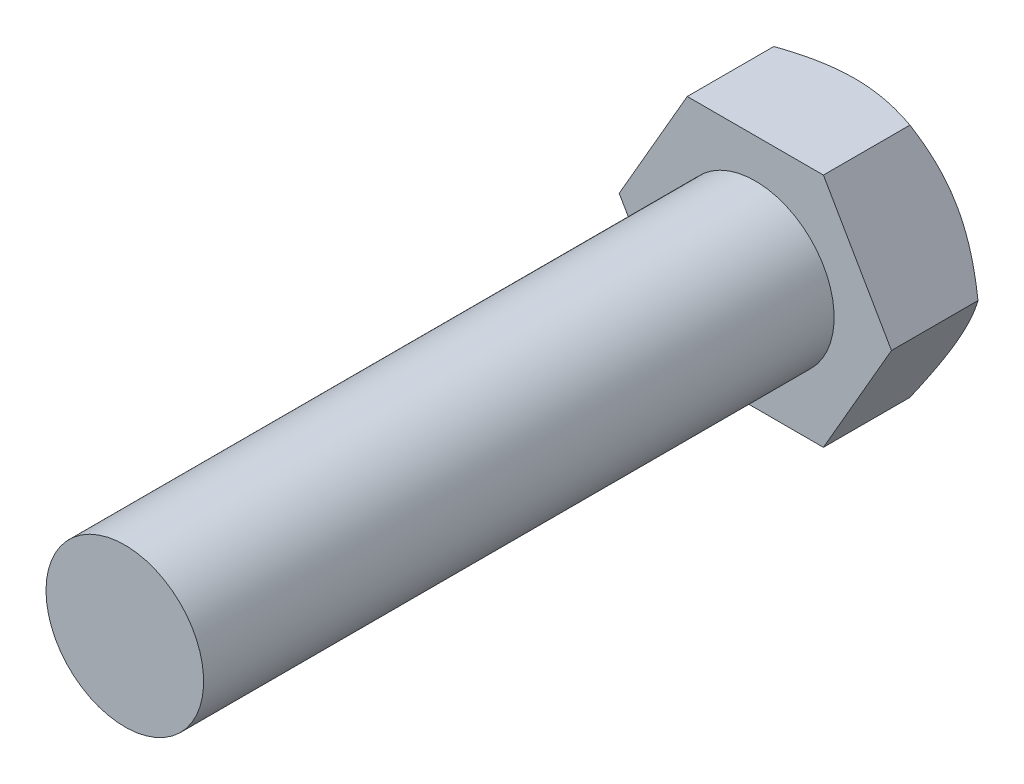
ISO-10303-21;
HEADER;
FILE_DESCRIPTION(('STEP AP214'),'2;1');
FILE_NAME('part.step','',(''),(''),'','','');
FILE_SCHEMA(('AUTOMOTIVE_DESIGN { 1 0 10303 214 1 1 1 1 }'));
ENDSEC;
DATA;
#1=APPLICATION_CONTEXT('core data for automotive mechanical design processes');
#2=APPLICATION_PROTOCOL_DEFINITION('international standard','automotive_design',2000,#1);
#3=PRODUCT_CONTEXT('',#1,'mechanical');
#4=PRODUCT('Part','Part','',(#3));
#5=PRODUCT_RELATED_PRODUCT_CATEGORY('part','',(#4));
#6=PRODUCT_DEFINITION_FORMATION('','',#4);
#7=PRODUCT_DEFINITION_CONTEXT('part definition',#1,'design');
#8=PRODUCT_DEFINITION('design','',#6,#7);
#9=PRODUCT_DEFINITION_SHAPE('','',#8);
#10=(LENGTH_UNIT() NAMED_UNIT(*) SI_UNIT(.MILLI.,.METRE.));
#11=(NAMED_UNIT(*) PLANE_ANGLE_UNIT() SI_UNIT($,.RADIAN.));
#12=(NAMED_UNIT(*) SI_UNIT($,.STERADIAN.) SOLID_ANGLE_UNIT());
#13=UNCERTAINTY_MEASURE_WITH_UNIT(LENGTH_MEASURE(1.E-05),#10,'distance_accuracy_value','');
#14=(GEOMETRIC_REPRESENTATION_CONTEXT(3) GLOBAL_UNCERTAINTY_ASSIGNED_CONTEXT((#13)) GLOBAL_UNIT_ASSIGNED_CONTEXT((#10,
#11,#12)) REPRESENTATION_CONTEXT('',''));
#15=CARTESIAN_POINT('',(0.,0.,0.));
#16=DIRECTION('',(0.,0.,1.));
#17=DIRECTION('',(1.,0.,0.));
#18=AXIS2_PLACEMENT_3D('',#15,#16,#17);
#19=CARTESIAN_POINT('',(8.22724133595232,-14.2499999999999,12.));
#20=DIRECTION('',(-0.866025403784441,0.499999999999995,0.));
#21=DIRECTION('',(-0.499999999999995,-0.866025403784442,0.));
#22=AXIS2_PLACEMENT_3D('',#19,#20,#21);
#23=PLANE('',#22);
#24=CARTESIAN_POINT('',(16.4545981419581,0.0002,1.54367623857331));
#25=CARTESIAN_POINT('',(16.2702027710889,-0.319182151026049,1.41457686556177));
#26=CARTESIAN_POINT('',(16.0847650075566,-0.64036977910591,1.29122129039313));
#27=CARTESIAN_POINT('',(15.7116973485323,-1.28654191919686,1.05783192254373));
#28=CARTESIAN_POINT('',(15.5240662870316,-1.61152845079415,0.947805605471427));
#29=CARTESIAN_POINT('',(15.1460050372611,-2.26634974376955,0.742674523883902));
#30=CARTESIAN_POINT('',(14.9555670057257,-2.5961980900823,0.647627094148037));
#31=CARTESIAN_POINT('',(14.5727278063531,-3.25929503452465,0.474996152203521));
#32=CARTESIAN_POINT('',(14.3803268349797,-3.592543292369,0.397410909846706));
#33=CARTESIAN_POINT('',(14.0008445291337,-4.24982592666768,0.26411196974776));
#34=CARTESIAN_POINT('',(13.8138244959943,-4.57375412609829,0.207704921734018));
#35=CARTESIAN_POINT('',(13.4385545784171,-5.22374068989432,0.114408315622114));
#36=CARTESIAN_POINT('',(13.2503046586876,-5.54979911538644,0.0775193201055583));
#37=CARTESIAN_POINT('',(12.87344399038,-6.2025409402697,0.0243983907336545));
#38=CARTESIAN_POINT('',(12.6848346786154,-6.52922185102659,0.00812599123836344));
#39=CARTESIAN_POINT('',(12.3074611283429,-7.1828520135311,-0.00338701659723766));
#40=CARTESIAN_POINT('',(12.1186968991966,-7.50980124906417,0.00137118609882797));
#41=CARTESIAN_POINT('',(11.7746279039238,-8.10574623018576,0.0290951119164761));
#42=CARTESIAN_POINT('',(11.6192531423396,-8.37486321146353,0.0487260549035489));
#43=CARTESIAN_POINT('',(11.3090929043488,-8.91207650215121,0.101771163045533));
#44=CARTESIAN_POINT('',(11.1543074321104,-9.18017280434171,0.135185425509894));
#45=CARTESIAN_POINT('',(10.8453822679376,-9.71524688442554,0.215198809661225));
#46=CARTESIAN_POINT('',(10.6912437385497,-9.98222264872932,0.261815776325662));
#47=CARTESIAN_POINT('',(10.384032194092,-10.5143286524018,0.367369149565712));
#48=CARTESIAN_POINT('',(10.2309591778352,-10.7794588938264,0.426305542415093));
#49=CARTESIAN_POINT('',(9.76401729285871,-11.5882259627877,0.624205597351124));
#50=CARTESIAN_POINT('',(9.4521077341481,-12.1284691658409,0.781664620654106));
#51=CARTESIAN_POINT('',(8.83483636934868,-13.1976145317309,1.13561787222836));
#52=CARTESIAN_POINT('',(8.52945782645586,-13.7265456835626,1.33199442517409));
#53=CARTESIAN_POINT('',(8.22712586589848,-14.2501999999999,1.54367623857331));
#54=B_SPLINE_CURVE_WITH_KNOTS('',3,(#24,#25,#26,#27,#28,#29,#30,#31,#32,#33,#34,#35,#36,#37,#38,
#39,#40,#41,#42,#43,#44,#45,#46,#47,#48,#49,#50,#51,#52,#53),.UNSPECIFIED.,.F.,.F.,(4,2,2,2,2,2,
2,2,2,2,2,2,2,2,4),(0.,1.17225958175616,2.34517360185186,3.52247351348348,4.6996567272014,
5.83398877469892,6.96835351601078,8.10048829320421,9.2325590660559,10.1663611394386,
11.1001698055235,12.0352466950305,12.9703225426859,14.8989154466219,16.8217634539733),.UNSPECIFIED.);
#55=CARTESIAN_POINT('',(16.4544826719043,0.,1.5435953847201));
#56=VERTEX_POINT('',#55);
#57=CARTESIAN_POINT('',(12.3408620039283,-7.12499999999991,0.));
#58=VERTEX_POINT('',#57);
#59=EDGE_CURVE('E125',#56,#58,#54,.T.);
#60=ORIENTED_EDGE('',*,*,#59,.F.);
#61=DIRECTION('',(0.,0.,-1.));
#62=VECTOR('',#61,1.);
#63=CARTESIAN_POINT('',(16.4544826719043,0.,12.));
#64=LINE('',#63,#62);
#65=CARTESIAN_POINT('',(16.4544826719043,0.,12.));
#66=VERTEX_POINT('',#65);
#67=EDGE_CURVE('E129',#66,#56,#64,.T.);
#68=ORIENTED_EDGE('',*,*,#67,.F.);
#69=DIRECTION('',(0.499999999999995,0.866025403784442,0.));
#70=VECTOR('',#69,1.);
#71=CARTESIAN_POINT('',(8.22724133595232,-14.2499999999999,12.));
#72=LINE('',#71,#70);
#73=CARTESIAN_POINT('',(8.22724133595232,-14.2499999999999,12.));
#74=VERTEX_POINT('',#73);
#75=EDGE_CURVE('E224',#74,#66,#72,.T.);
#76=ORIENTED_EDGE('',*,*,#75,.F.);
#77=DIRECTION('',(0.,0.,-1.));
#78=VECTOR('',#77,1.);
#79=CARTESIAN_POINT('',(8.22724133595232,-14.2499999999999,12.));
#80=LINE('',#79,#78);
#81=CARTESIAN_POINT('',(8.22724133595232,-14.2499999999999,1.5435953847201));
#82=VERTEX_POINT('',#81);
#83=EDGE_CURVE('E212',#74,#82,#80,.T.);
#84=ORIENTED_EDGE('',*,*,#83,.T.);
#85=EDGE_CURVE('E180',#58,#82,#54,.T.);
#86=ORIENTED_EDGE('',*,*,#85,.F.);
#87=EDGE_LOOP('',(#60,#68,#76,#84,#86));
#88=FACE_BOUND('',#87,.T.);
#89=ADVANCED_FACE('F35',(#88),#23,.F.);
#90=CARTESIAN_POINT('',(16.4544826719043,0.,12.));
#91=DIRECTION('',(-0.866025403784438,-0.500000000000001,0.));
#92=DIRECTION('',(0.500000000000001,-0.866025403784438,0.));
#93=AXIS2_PLACEMENT_3D('',#90,#91,#92);
#94=PLANE('',#93);
#95=CARTESIAN_POINT('',(8.22712586589829,14.2502,1.54367623857331));
#96=CARTESIAN_POINT('',(8.41152123676754,13.930817848974,1.41457686556177));
#97=CARTESIAN_POINT('',(8.59695900029982,13.6096302208941,1.29122129039313));
#98=CARTESIAN_POINT('',(8.97002665932416,12.9634580808032,1.05783192254373));
#99=CARTESIAN_POINT('',(9.15765772082486,12.6384715492059,0.947805605471423));
#100=CARTESIAN_POINT('',(9.53571897059531,11.9836502562305,0.742674523883895));
#101=CARTESIAN_POINT('',(9.72615700213073,11.6538019099177,0.647627094148027));
#102=CARTESIAN_POINT('',(10.1089962015033,10.9907049654754,0.474996152203506));
#103=CARTESIAN_POINT('',(10.3013971728767,10.657456707631,0.39741090984669));
#104=CARTESIAN_POINT('',(10.6808794787228,10.0001740733323,0.26411196974774));
#105=CARTESIAN_POINT('',(10.8678995118621,9.67624587390173,0.207704921733996));
#106=CARTESIAN_POINT('',(11.2431694294394,9.0262593101057,0.114408315622088));
#107=CARTESIAN_POINT('',(11.4314193491688,8.70020088461359,0.0775193201055301));
#108=CARTESIAN_POINT('',(11.8082800174765,8.04745905973033,0.0243983907336221));
#109=CARTESIAN_POINT('',(11.9968893292411,7.72077814897344,0.00812599123832916));
#110=CARTESIAN_POINT('',(12.3742628795135,7.06714798646893,-0.00338701659727748));
#111=CARTESIAN_POINT('',(12.5630271086599,6.74019875093587,0.00137118609878444));
#112=CARTESIAN_POINT('',(12.9070961039327,6.14425376981427,0.0290951119164303));
#113=CARTESIAN_POINT('',(13.0624708655169,5.8751367885365,0.0487260549035043));
#114=CARTESIAN_POINT('',(13.3726311035077,5.3379234978488,0.101771163045488));
#115=CARTESIAN_POINT('',(13.5274165757461,5.0698271956583,0.135185425509848));
#116=CARTESIAN_POINT('',(13.8363417399189,4.53475311557446,0.215198809661179));
#117=CARTESIAN_POINT('',(13.9904802693068,4.26777735127067,0.261815776325618));
#118=CARTESIAN_POINT('',(14.2976918137645,3.7356713475982,0.36736914956567));
#119=CARTESIAN_POINT('',(14.4507648300213,3.47054110617358,0.426305542415053));
#120=CARTESIAN_POINT('',(14.9177067149979,2.66177403721225,0.624205597351089));
#121=CARTESIAN_POINT('',(15.2296162737085,2.12153083415906,0.781664620654077));
#122=CARTESIAN_POINT('',(15.8468876385079,1.05238546826904,1.13561787222834));
#123=CARTESIAN_POINT('',(16.1522661814008,0.523454316437301,1.33199442517408));
#124=CARTESIAN_POINT('',(16.4545981419581,-0.000200000000002765,1.54367623857331));
#125=B_SPLINE_CURVE_WITH_KNOTS('',3,(#95,#96,#97,#98,#99,#100,#101,#102,#103,#104,#105,#106,
#107,#108,#109,#110,#111,#112,#113,#114,#115,#116,#117,#118,#119,#120,#121,#122,#123,#124),
.UNSPECIFIED.,.F.,.F.,(4,2,2,2,2,2,2,2,2,2,2,2,2,2,4),(0.,1.17225958175616,2.34517360185185,
3.52247351348347,4.6996567272014,5.83398877469892,6.96835351601078,8.10048829320421,
9.2325590660559,10.1663611394386,11.1001698055236,12.0352466950306,12.970322542686,
14.898915446622,16.8217634539735),.UNSPECIFIED.);
#126=CARTESIAN_POINT('',(8.22724133595213,14.25,1.5435953847201));
#127=VERTEX_POINT('',#126);
#128=CARTESIAN_POINT('',(12.3408620039282,7.125,0.));
#129=VERTEX_POINT('',#128);
#130=EDGE_CURVE('E106',#127,#129,#125,.T.);
#131=ORIENTED_EDGE('',*,*,#130,.F.);
#132=DIRECTION('',(0.,0.,-1.));
#133=VECTOR('',#132,1.);
#134=CARTESIAN_POINT('',(8.22724133595212,14.25,12.));
#135=LINE('',#134,#133);
#136=CARTESIAN_POINT('',(8.22724133595212,14.25,12.));
#137=VERTEX_POINT('',#136);
#138=EDGE_CURVE('E209',#137,#127,#135,.T.);
#139=ORIENTED_EDGE('',*,*,#138,.F.);
#140=DIRECTION('',(-0.500000000000001,0.866025403784438,0.));
#141=VECTOR('',#140,1.);
#142=CARTESIAN_POINT('',(16.4544826719043,0.,12.));
#143=LINE('',#142,#141);
#144=EDGE_CURVE('E221',#66,#137,#143,.T.);
#145=ORIENTED_EDGE('',*,*,#144,.F.);
#146=ORIENTED_EDGE('',*,*,#67,.T.);
#147=EDGE_CURVE('E118',#129,#56,#125,.T.);
#148=ORIENTED_EDGE('',*,*,#147,.F.);
#149=EDGE_LOOP('',(#131,#139,#145,#146,#148));
#150=FACE_BOUND('',#149,.T.);
#151=ADVANCED_FACE('F134',(#150),#94,.F.);
#152=CARTESIAN_POINT('',(8.22724133595212,14.25,12.));
#153=DIRECTION('',(0.,-1.,0.));
#154=DIRECTION('',(1.,0.,0.));
#155=AXIS2_PLACEMENT_3D('',#152,#153,#154);
#156=PLANE('',#155);
#157=CARTESIAN_POINT('',(-21.0307797019653,14.2499999999999,7.81001811966322));
#158=CARTESIAN_POINT('',(-20.7483823576286,14.2499999999999,7.64632331947967));
#159=CARTESIAN_POINT('',(-20.4655379412463,14.2499999999999,7.4834001850228));
#160=CARTESIAN_POINT('',(-19.8988662895447,14.2499999999999,7.15926464174982));
#161=CARTESIAN_POINT('',(-19.6150390424903,14.2499999999999,6.99805225345443));
#162=CARTESIAN_POINT('',(-18.7618621687209,14.2499999999999,6.51718290891407));
#163=CARTESIAN_POINT('',(-18.1909147117392,14.2499999999999,6.2003503264211));
#164=CARTESIAN_POINT('',(-17.0403422421381,14.2499999999999,5.57396574075119));
#165=CARTESIAN_POINT('',(-16.4606851849295,14.2499999999999,5.26447246356248));
#166=CARTESIAN_POINT('',(-15.2953015030134,14.2499999999999,4.65717125551426));
#167=CARTESIAN_POINT('',(-14.7095752125618,14.2499999999999,4.35936268541163));
#168=CARTESIAN_POINT('',(-13.5040829750654,14.2499999999999,3.76522851801957));
#169=CARTESIAN_POINT('',(-12.8839793072316,14.2499999999999,3.46958468052069));
#170=CARTESIAN_POINT('',(-11.6342031113975,14.2499999999999,2.89887033998608));
#171=CARTESIAN_POINT('',(-11.0045292947839,14.2499999999999,2.62380263757454));
#172=CARTESIAN_POINT('',(-9.73556643770717,14.2499999999999,2.1009998327649));
#173=CARTESIAN_POINT('',(-9.09630319830344,14.2499999999999,1.85320258200597));
#174=CARTESIAN_POINT('',(-7.80546022735872,14.2499999999999,1.39216829623307));
#175=CARTESIAN_POINT('',(-7.15388517918682,14.2499999999999,1.17891840372017));
#176=CARTESIAN_POINT('',(-6.15490103920526,14.2499999999999,0.888784713402826));
#177=CARTESIAN_POINT('',(-5.81217699592205,14.25,0.79569769642083));
#178=CARTESIAN_POINT('',(-5.12335190996157,14.25,0.622912642539462));
#179=CARTESIAN_POINT('',(-4.77725095115967,14.25,0.543214273985806));
#180=CARTESIAN_POINT('',(-4.08198738138723,14.25,0.398706557868054));
#181=CARTESIAN_POINT('',(-3.73282520177465,14.25,0.333895146500978));
#182=CARTESIAN_POINT('',(-3.03187366457333,14.25,0.220548347806509));
#183=CARTESIAN_POINT('',(-2.6800844898489,14.25,0.172011838187856));
#184=CARTESIAN_POINT('',(-1.98082678630545,14.25,0.0930929977810811));
#185=CARTESIAN_POINT('',(-1.63339333688098,14.25,0.0624018506834644));
#186=CARTESIAN_POINT('',(-0.937416049600682,14.25,0.0186216361508801));
#187=CARTESIAN_POINT('',(-0.588872230500853,14.25,0.00553227295591957));
#188=CARTESIAN_POINT('',(0.108457010376487,14.25,-0.00269726296584866));
#189=CARTESIAN_POINT('',(0.457242448764197,14.25,0.00216395348047377));
#190=CARTESIAN_POINT('',(1.15410748647395,14.25,0.0297062624075028));
#191=CARTESIAN_POINT('',(1.50218706805267,14.25,0.052387797409515));
#192=CARTESIAN_POINT('',(2.23397893002818,14.25,0.118341658495994));
#193=CARTESIAN_POINT('',(2.61751657393895,14.25,0.163558397540984));
#194=CARTESIAN_POINT('',(3.3817017282793,14.25,0.273770735943497));
#195=CARTESIAN_POINT('',(3.76234910401614,14.25,0.338767251353207));
#196=CARTESIAN_POINT('',(4.89916132273453,14.25,0.560923639802966));
#197=CARTESIAN_POINT('',(5.65012671605997,14.25,0.745243534894716));
#198=CARTESIAN_POINT('',(6.77339561256118,14.25,1.0671421899277));
#199=CARTESIAN_POINT('',(7.15202190719991,14.25,1.18377650694768));
#200=CARTESIAN_POINT('',(7.90504472585432,14.25,1.43008700865407));
#201=CARTESIAN_POINT('',(8.27944120203226,14.25,1.55976334067712));
#202=CARTESIAN_POINT('',(9.02405598500581,14.25,1.83034808142679));
#203=CARTESIAN_POINT('',(9.39427496097174,14.25,1.97125466122707));
#204=CARTESIAN_POINT('',(9.94670366195413,14.25,2.18987612495198));
#205=CARTESIAN_POINT('',(10.1303605268574,14.25,2.26395904254066));
#206=CARTESIAN_POINT('',(10.4967508379489,14.25,2.41437593090951));
#207=CARTESIAN_POINT('',(10.6794842809345,14.25,2.49070990949077));
#208=CARTESIAN_POINT('',(11.2438796387109,14.25,2.73027732491905));
#209=CARTESIAN_POINT('',(11.6240427879813,14.25,2.89705018205499));
#210=CARTESIAN_POINT('',(12.3808443413054,14.25,3.23843099074409));
#211=CARTESIAN_POINT('',(12.7574825499094,14.25,3.41303937368461));
#212=CARTESIAN_POINT('',(13.5076391518044,14.25,3.76900351806248));
#213=CARTESIAN_POINT('',(13.8811569414281,14.25,3.95036054968127));
#214=CARTESIAN_POINT('',(14.6253304739946,14.25,4.31886226783892));
#215=CARTESIAN_POINT('',(14.9959861478449,14.25,4.50600709355485));
#216=CARTESIAN_POINT('',(16.1047253967806,14.25,5.07522112106339));
#217=CARTESIAN_POINT('',(16.8389687093434,14.25,5.46477601492714));
#218=CARTESIAN_POINT('',(18.2991651712054,14.25,6.25887156441082));
#219=CARTESIAN_POINT('',(19.0251190762284,14.25,6.66341083944026));
#220=CARTESIAN_POINT('',(20.4729534117608,14.25,7.4855095081588));
#221=CARTESIAN_POINT('',(21.1948107949419,14.25,7.90310940213855));
#222=CARTESIAN_POINT('',(22.6331671431204,14.25,8.74744581742437));
#223=CARTESIAN_POINT('',(23.3496660066554,14.2500000000001,9.17418251114567));
#224=CARTESIAN_POINT('',(24.777939315821,14.2500000000001,10.0347104386038));
#225=CARTESIAN_POINT('',(25.4897158637858,14.2500000000001,10.4684981884054));
#226=CARTESIAN_POINT('',(26.9096598703761,14.2500000000001,11.3419223321648));
#227=CARTESIAN_POINT('',(27.6178273550484,14.2500000000001,11.7815586838301));
#228=CARTESIAN_POINT('',(28.9335887273037,14.2500000000001,12.604579120696));
#229=CARTESIAN_POINT('',(29.5415676905293,14.2500000000001,12.9873482752793));
#230=CARTESIAN_POINT('',(30.7556135160704,14.2500000000001,13.7559082237712));
#231=CARTESIAN_POINT('',(31.3616803741865,14.2500000000001,14.1416990243094));
#232=CARTESIAN_POINT('',(33.1775718118149,14.2500000000001,15.3030252977204));
#233=CARTESIAN_POINT('',(34.3849307145724,14.2500000000001,16.0824163923204));
#234=CARTESIAN_POINT('',(36.7863879492325,14.2500000000001,17.6434649177575));
#235=CARTESIAN_POINT('',(37.9805203918267,14.2500000000001,18.4250699712967));
#236=CARTESIAN_POINT('',(39.7687535007112,14.2500000000001,19.6017705920974));
#237=CARTESIAN_POINT('',(40.3642891725478,14.2500000000001,19.9946878693449));
#238=CARTESIAN_POINT('',(41.5545057310709,14.2500000000001,20.7818122763548));
#239=CARTESIAN_POINT('',(42.1491866196047,14.2500000000001,21.1760194033236));
#240=CARTESIAN_POINT('',(42.7434921426331,14.2500000000001,21.5707914469479));
#241=B_SPLINE_CURVE_WITH_KNOTS('',3,(#157,#158,#159,#160,#161,#162,#163,#164,#165,#166,#167,
#168,#169,#170,#171,#172,#173,#174,#175,#176,#177,#178,#179,#180,#181,#182,#183,#184,#185,#186,
#187,#188,#189,#190,#191,#192,#193,#194,#195,#196,#197,#198,#199,#200,#201,#202,#203,#204,#205,
#206,#207,#208,#209,#210,#211,#212,#213,#214,#215,#216,#217,#218,#219,#220,#221,#222,#223,#224,
#225,#226,#227,#228,#229,#230,#231,#232,#233,#234,#235,#236,#237,#238,#239,#240),.UNSPECIFIED.,
.F.,.F.,(4,2,2,2,2,2,2,2,2,2,2,2,2,2,2,2,2,2,2,2,2,2,2,2,2,2,2,2,2,2,2,2,2,2,2,2,2,2,2,2,2,4),
(0.,0.979231234309724,1.95847420142742,3.91729774202127,5.88851105642767,7.859616379545,
9.92025145556761,11.9811664968548,14.0372830301485,16.0926325713103,17.1578335686469,
18.2230081756736,19.2880350265764,20.3529884198158,21.3989175407043,22.4448290867914,
23.4908215763742,24.5368400412835,25.6948409267628,26.8528954503977,29.1692132143132,
30.3576166277267,31.5460334681327,32.734257160275,33.3283511284294,33.9224471556704,
35.1677373504036,36.4130961892996,37.6586906179924,38.9043150223862,41.3976010899977,
43.8906580065778,46.3924126125239,48.8942144693065,51.3948156502804,53.8953987586699,
56.0506975557643,58.2060010830163,62.5171625723639,66.7986988325867,68.9391227376693,
71.0795420101602),.UNSPECIFIED.);
#242=CARTESIAN_POINT('',(-8.22724133595222,14.2499999999999,1.5435953847201));
#243=VERTEX_POINT('',#242);
#244=CARTESIAN_POINT('',(0.,14.25,0.));
#245=VERTEX_POINT('',#244);
#246=EDGE_CURVE('E51',#243,#245,#241,.T.);
#247=ORIENTED_EDGE('',*,*,#246,.F.);
#248=DIRECTION('',(0.,0.,-1.));
#249=VECTOR('',#248,1.);
#250=CARTESIAN_POINT('',(-8.22724133595222,14.2499999999999,12.));
#251=LINE('',#250,#249);
#252=CARTESIAN_POINT('',(-8.22724133595222,14.2499999999999,12.));
#253=VERTEX_POINT('',#252);
#254=EDGE_CURVE('E206',#253,#243,#251,.T.);
#255=ORIENTED_EDGE('',*,*,#254,.F.);
#256=DIRECTION('',(-1.,0.,0.));
#257=VECTOR('',#256,1.);
#258=CARTESIAN_POINT('',(8.22724133595212,14.25,12.));
#259=LINE('',#258,#257);
#260=EDGE_CURVE('E220',#137,#253,#259,.T.);
#261=ORIENTED_EDGE('',*,*,#260,.F.);
#262=ORIENTED_EDGE('',*,*,#138,.T.);
#263=EDGE_CURVE('E112',#245,#127,#241,.T.);
#264=ORIENTED_EDGE('',*,*,#263,.F.);
#265=EDGE_LOOP('',(#247,#255,#261,#262,#264));
#266=FACE_BOUND('',#265,.T.);
#267=ADVANCED_FACE('F218',(#266),#156,.F.);
#268=CARTESIAN_POINT('',(-8.22724133595222,14.2499999999999,12.));
#269=DIRECTION('',(0.866025403784441,-0.499999999999995,0.));
#270=DIRECTION('',(0.499999999999995,0.866025403784442,0.));
#271=AXIS2_PLACEMENT_3D('',#268,#269,#270);
#272=PLANE('',#271);
#273=CARTESIAN_POINT('',(-16.4545981419581,-0.00020000000011454,1.54367623857331));
#274=CARTESIAN_POINT('',(-16.2702027710889,0.319182151025933,1.41457686556176));
#275=CARTESIAN_POINT('',(-16.0847650075566,0.640369779105794,1.29122129039312));
#276=CARTESIAN_POINT('',(-15.7116973485323,1.28654191919674,1.05783192254372));
#277=CARTESIAN_POINT('',(-15.5240662870316,1.61152845079403,0.947805605471421));
#278=CARTESIAN_POINT('',(-15.1460050372611,2.26634974376943,0.742674523883893));
#279=CARTESIAN_POINT('',(-14.9555670057257,2.59619809008218,0.647627094148027));
#280=CARTESIAN_POINT('',(-14.5727278063531,3.25929503452453,0.474996152203507));
#281=CARTESIAN_POINT('',(-14.3803268349797,3.59254329236888,0.397410909846689));
#282=CARTESIAN_POINT('',(-14.0008445291337,4.24982592666756,0.264111969747739));
#283=CARTESIAN_POINT('',(-13.8138244959943,4.57375412609817,0.207704921733994));
#284=CARTESIAN_POINT('',(-13.4385545784171,5.2237406898942,0.114408315622086));
#285=CARTESIAN_POINT('',(-13.2503046586877,5.54979911538631,0.0775193201055287));
#286=CARTESIAN_POINT('',(-12.87344399038,6.20254094026958,0.0243983907336211));
#287=CARTESIAN_POINT('',(-12.6848346786154,6.52922185102647,0.00812599123832832));
#288=CARTESIAN_POINT('',(-12.3074611283429,7.18285201353098,-0.00338701659727724));
#289=CARTESIAN_POINT('',(-12.1186968991966,7.50980124906404,0.00137118609878552));
#290=CARTESIAN_POINT('',(-11.7746279039238,8.10574623018564,0.0290951119164306));
#291=CARTESIAN_POINT('',(-11.6192531423396,8.37486321146342,0.0487260549035033));
#292=CARTESIAN_POINT('',(-11.3090929043488,8.91207650215112,0.101771163045486));
#293=CARTESIAN_POINT('',(-11.1543074321104,9.18017280434162,0.135185425509848));
#294=CARTESIAN_POINT('',(-10.8453822679376,9.71524688442546,0.215198809661179));
#295=CARTESIAN_POINT('',(-10.6912437385497,9.98222264872925,0.261815776325618));
#296=CARTESIAN_POINT('',(-10.384032194092,10.5143286524017,0.36736914956567));
#297=CARTESIAN_POINT('',(-10.2309591778352,10.7794588938263,0.426305542415053));
#298=CARTESIAN_POINT('',(-9.76401729285866,11.5882259627877,0.624205597351091));
#299=CARTESIAN_POINT('',(-9.45210773414803,12.1284691658409,0.781664620654079));
#300=CARTESIAN_POINT('',(-8.8348363693486,13.1976145317309,1.13561787222834));
#301=CARTESIAN_POINT('',(-8.52945782645577,13.7265456835626,1.33199442517408));
#302=CARTESIAN_POINT('',(-8.22712586589838,14.2501999999999,1.54367623857331));
#303=B_SPLINE_CURVE_WITH_KNOTS('',3,(#273,#274,#275,#276,#277,#278,#279,#280,#281,#282,#283,
#284,#285,#286,#287,#288,#289,#290,#291,#292,#293,#294,#295,#296,#297,#298,#299,#300,#301,#302),
.UNSPECIFIED.,.F.,.F.,(4,2,2,2,2,2,2,2,2,2,2,2,2,2,4),(0.,1.17225958175616,2.34517360185185,
3.52247351348347,4.6996567272014,5.83398877469892,6.96835351601078,8.10048829320421,
9.2325590660559,10.1663611394386,11.1001698055236,12.0352466950306,12.970322542686,
14.898915446622,16.8217634539735),.UNSPECIFIED.);
#304=CARTESIAN_POINT('',(-16.4544826719043,-1.14889862020934E-13,1.5435953847201));
#305=VERTEX_POINT('',#304);
#306=CARTESIAN_POINT('',(-12.3408620039283,7.12499999999991,0.));
#307=VERTEX_POINT('',#306);
#308=EDGE_CURVE('E58',#305,#307,#303,.T.);
#309=ORIENTED_EDGE('',*,*,#308,.F.);
#310=DIRECTION('',(0.,0.,-1.));
#311=VECTOR('',#310,1.);
#312=CARTESIAN_POINT('',(-16.4544826719043,-1.14901038378543E-13,12.));
#313=LINE('',#312,#311);
#314=CARTESIAN_POINT('',(-16.4544826719043,-1.14901038378543E-13,12.));
#315=VERTEX_POINT('',#314);
#316=EDGE_CURVE('E200',#315,#305,#313,.T.);
#317=ORIENTED_EDGE('',*,*,#316,.F.);
#318=DIRECTION('',(-0.499999999999995,-0.866025403784442,0.));
#319=VECTOR('',#318,1.);
#320=CARTESIAN_POINT('',(-8.22724133595222,14.2499999999999,12.));
#321=LINE('',#320,#319);
#322=EDGE_CURVE('E239',#253,#315,#321,.T.);
#323=ORIENTED_EDGE('',*,*,#322,.F.);
#324=ORIENTED_EDGE('',*,*,#254,.T.);
#325=EDGE_CURVE('E117',#307,#243,#303,.T.);
#326=ORIENTED_EDGE('',*,*,#325,.F.);
#327=EDGE_LOOP('',(#309,#317,#323,#324,#326));
#328=FACE_BOUND('',#327,.T.);
#329=ADVANCED_FACE('F198',(#328),#272,.F.);
#330=CARTESIAN_POINT('',(-16.4544826719043,-1.14901038378543E-13,12.));
#331=DIRECTION('',(0.866025403784434,0.500000000000007,0.));
#332=DIRECTION('',(-0.500000000000007,0.866025403784435,0.));
#333=AXIS2_PLACEMENT_3D('',#330,#331,#332);
#334=PLANE('',#333);
#335=CARTESIAN_POINT('',(-8.22712586589818,-14.2502000000001,1.54367623857331));
#336=CARTESIAN_POINT('',(-8.41152123676744,-13.930817848974,1.41457686556176));
#337=CARTESIAN_POINT('',(-8.59695900029972,-13.6096302208942,1.29122129039312));
#338=CARTESIAN_POINT('',(-8.97002665932407,-12.9634580808032,1.05783192254372));
#339=CARTESIAN_POINT('',(-9.15765772082477,-12.6384715492059,0.94780560547142));
#340=CARTESIAN_POINT('',(-9.53571897059522,-11.9836502562305,0.742674523883891));
#341=CARTESIAN_POINT('',(-9.72615700213064,-11.6538019099178,0.647627094148025));
#342=CARTESIAN_POINT('',(-10.1089962015033,-10.9907049654754,0.474996152203505));
#343=CARTESIAN_POINT('',(-10.3013971728767,-10.6574567076311,0.397410909846687));
#344=CARTESIAN_POINT('',(-10.6808794787227,-10.0001740733324,0.264111969747738));
#345=CARTESIAN_POINT('',(-10.8678995118621,-9.67624587390181,0.207704921733995));
#346=CARTESIAN_POINT('',(-11.2431694294393,-9.02625931010578,0.114408315622088));
#347=CARTESIAN_POINT('',(-11.4314193491688,-8.70020088461367,0.0775193201055291));
#348=CARTESIAN_POINT('',(-11.8082800174764,-8.04745905973041,0.0243983907336206));
#349=CARTESIAN_POINT('',(-11.996889329241,-7.72077814897353,0.00812599123832783));
#350=CARTESIAN_POINT('',(-12.3742628795135,-7.06714798646902,-0.00338701659727796));
#351=CARTESIAN_POINT('',(-12.5630271086598,-6.74019875093596,0.00137118609878467));
#352=CARTESIAN_POINT('',(-12.9070961039326,-6.14425376981436,0.0290951119164302));
#353=CARTESIAN_POINT('',(-13.0624708655168,-5.87513678853659,0.0487260549035034));
#354=CARTESIAN_POINT('',(-13.3726311035076,-5.33792349784889,0.101771163045486));
#355=CARTESIAN_POINT('',(-13.5274165757461,-5.0698271956584,0.135185425509847));
#356=CARTESIAN_POINT('',(-13.8363417399189,-4.53475311557455,0.215198809661178));
#357=CARTESIAN_POINT('',(-13.9904802693068,-4.26777735127077,0.261815776325617));
#358=CARTESIAN_POINT('',(-14.2976918137645,-3.7356713475983,0.36736914956567));
#359=CARTESIAN_POINT('',(-14.4507648300213,-3.47054110617368,0.426305542415052));
#360=CARTESIAN_POINT('',(-14.9177067149978,-2.66177403721236,0.624205597351087));
#361=CARTESIAN_POINT('',(-15.2296162737085,-2.12153083415916,0.781664620654075));
#362=CARTESIAN_POINT('',(-15.8468876385079,-1.05238546826915,1.13561787222834));
#363=CARTESIAN_POINT('',(-16.1522661814008,-0.523454316437416,1.33199442517408));
#364=CARTESIAN_POINT('',(-16.4545981419581,0.000199999999888041,1.54367623857331));
#365=B_SPLINE_CURVE_WITH_KNOTS('',3,(#335,#336,#337,#338,#339,#340,#341,#342,#343,#344,#345,
#346,#347,#348,#349,#350,#351,#352,#353,#354,#355,#356,#357,#358,#359,#360,#361,#362,#363,#364),
.UNSPECIFIED.,.F.,.F.,(4,2,2,2,2,2,2,2,2,2,2,2,2,2,4),(0.,1.17225958175616,2.34517360185186,
3.52247351348348,4.6996567272014,5.83398877469892,6.96835351601078,8.10048829320421,
9.2325590660559,10.1663611394386,11.1001698055236,12.0352466950306,12.970322542686,
14.898915446622,16.8217634539735),.UNSPECIFIED.);
#366=CARTESIAN_POINT('',(-8.22724133595202,-14.2500000000001,1.5435953847201));
#367=VERTEX_POINT('',#366);
#368=CARTESIAN_POINT('',(-12.3408620039282,-7.12500000000008,0.));
#369=VERTEX_POINT('',#368);
#370=EDGE_CURVE('E174',#367,#369,#365,.T.);
#371=ORIENTED_EDGE('',*,*,#370,.F.);
#372=DIRECTION('',(0.,0.,-1.));
#373=VECTOR('',#372,1.);
#374=CARTESIAN_POINT('',(-8.22724133595202,-14.2500000000001,12.));
#375=LINE('',#374,#373);
#376=CARTESIAN_POINT('',(-8.22724133595202,-14.2500000000001,12.));
#377=VERTEX_POINT('',#376);
#378=EDGE_CURVE('E207',#377,#367,#375,.T.);
#379=ORIENTED_EDGE('',*,*,#378,.F.);
#380=DIRECTION('',(0.500000000000007,-0.866025403784435,0.));
#381=VECTOR('',#380,1.);
#382=CARTESIAN_POINT('',(-16.4544826719043,-1.14901038378543E-13,12.));
#383=LINE('',#382,#381);
#384=EDGE_CURVE('E205',#315,#377,#383,.T.);
#385=ORIENTED_EDGE('',*,*,#384,.F.);
#386=ORIENTED_EDGE('',*,*,#316,.T.);
#387=EDGE_CURVE('E136',#369,#305,#365,.T.);
#388=ORIENTED_EDGE('',*,*,#387,.F.);
#389=EDGE_LOOP('',(#371,#379,#385,#386,#388));
#390=FACE_BOUND('',#389,.T.);
#391=ADVANCED_FACE('F203',(#390),#334,.F.);
#392=CARTESIAN_POINT('',(-8.22724133595202,-14.2500000000001,12.));
#393=DIRECTION('',(0.,1.,0.));
#394=DIRECTION('',(-1.,0.,0.));
#395=AXIS2_PLACEMENT_3D('',#392,#393,#394);
#396=PLANE('',#395);
#397=CARTESIAN_POINT('',(-21.0307797019651,-14.2500000000002,7.81001811966321));
#398=CARTESIAN_POINT('',(-20.7483823576284,-14.2500000000002,7.64632331947967));
#399=CARTESIAN_POINT('',(-20.4655379412461,-14.2500000000002,7.48340018502279));
#400=CARTESIAN_POINT('',(-19.8988662895445,-14.2500000000002,7.15926464174982));
#401=CARTESIAN_POINT('',(-19.6150390424901,-14.2500000000002,6.99805225345442));
#402=CARTESIAN_POINT('',(-18.7618621687207,-14.2500000000002,6.51718290891407));
#403=CARTESIAN_POINT('',(-18.190914711739,-14.2500000000002,6.20035032642109));
#404=CARTESIAN_POINT('',(-17.0403422421379,-14.2500000000001,5.57396574075119));
#405=CARTESIAN_POINT('',(-16.4606851849293,-14.2500000000001,5.26447246356247));
#406=CARTESIAN_POINT('',(-15.2953015030132,-14.2500000000001,4.65717125551426));
#407=CARTESIAN_POINT('',(-14.7095752125616,-14.2500000000001,4.35936268541162));
#408=CARTESIAN_POINT('',(-13.5040829750652,-14.2500000000001,3.76522851801956));
#409=CARTESIAN_POINT('',(-12.8839793072314,-14.2500000000001,3.46958468052068));
#410=CARTESIAN_POINT('',(-11.6342031113973,-14.2500000000001,2.89887033998607));
#411=CARTESIAN_POINT('',(-11.0045292947837,-14.2500000000001,2.62380263757454));
#412=CARTESIAN_POINT('',(-9.73556643770697,-14.2500000000001,2.1009998327649));
#413=CARTESIAN_POINT('',(-9.09630319830324,-14.2500000000001,1.85320258200597));
#414=CARTESIAN_POINT('',(-7.80546022735853,-14.2500000000001,1.39216829623307));
#415=CARTESIAN_POINT('',(-7.15388517918663,-14.25,1.17891840372017));
#416=CARTESIAN_POINT('',(-6.15490103920506,-14.25,0.888784713402826));
#417=CARTESIAN_POINT('',(-5.81217699592186,-14.25,0.795697696420831));
#418=CARTESIAN_POINT('',(-5.12335190996138,-14.25,0.622912642539463));
#419=CARTESIAN_POINT('',(-4.77725095115948,-14.25,0.543214273985808));
#420=CARTESIAN_POINT('',(-4.08198738138703,-14.25,0.398706557868055));
#421=CARTESIAN_POINT('',(-3.73282520177446,-14.25,0.333895146500979));
#422=CARTESIAN_POINT('',(-3.03187366457313,-14.25,0.22054834780651));
#423=CARTESIAN_POINT('',(-2.68008448984871,-14.25,0.172011838187857));
#424=CARTESIAN_POINT('',(-1.98082678630525,-14.25,0.093092997781081));
#425=CARTESIAN_POINT('',(-1.63339333688079,-14.25,0.062401850683463));
#426=CARTESIAN_POINT('',(-0.937416049600484,-14.25,0.0186216361508789));
#427=CARTESIAN_POINT('',(-0.588872230500655,-14.25,0.00553227295591971));
#428=CARTESIAN_POINT('',(0.108457010376686,-14.25,-0.00269726296584774));
#429=CARTESIAN_POINT('',(0.457242448764398,-14.25,0.00216395348047414));
#430=CARTESIAN_POINT('',(1.15410748647415,-14.25,0.0297062624075023));
#431=CARTESIAN_POINT('',(1.50218706805287,-14.25,0.0523877974095143));
#432=CARTESIAN_POINT('',(2.23397893002838,-14.2499999999999,0.118341658495994));
#433=CARTESIAN_POINT('',(2.61751657393915,-14.2499999999999,0.163558397540985));
#434=CARTESIAN_POINT('',(3.38170172827951,-14.2499999999999,0.273770735943497));
#435=CARTESIAN_POINT('',(3.76234910401634,-14.2499999999999,0.338767251353207));
#436=CARTESIAN_POINT('',(4.89916132273473,-14.2499999999999,0.560923639802964));
#437=CARTESIAN_POINT('',(5.65012671606017,-14.2499999999999,0.745243534894715));
#438=CARTESIAN_POINT('',(6.77339561256138,-14.2499999999999,1.0671421899277));
#439=CARTESIAN_POINT('',(7.15202190720011,-14.2499999999999,1.18377650694768));
#440=CARTESIAN_POINT('',(7.90504472585453,-14.2499999999999,1.43008700865407));
#441=CARTESIAN_POINT('',(8.27944120203247,-14.2499999999999,1.55976334067712));
#442=CARTESIAN_POINT('',(9.02405598500601,-14.2499999999999,1.83034808142679));
#443=CARTESIAN_POINT('',(9.39427496097194,-14.2499999999999,1.97125466122707));
#444=CARTESIAN_POINT('',(9.94670366195432,-14.2499999999999,2.18987612495197));
#445=CARTESIAN_POINT('',(10.1303605268576,-14.2499999999999,2.26395904254066));
#446=CARTESIAN_POINT('',(10.4967508379491,-14.2499999999999,2.41437593090951));
#447=CARTESIAN_POINT('',(10.6794842809347,-14.2499999999999,2.49070990949077));
#448=CARTESIAN_POINT('',(11.2438796387111,-14.2499999999999,2.73027732491905));
#449=CARTESIAN_POINT('',(11.6240427879815,-14.2499999999998,2.89705018205499));
#450=CARTESIAN_POINT('',(12.3808443413056,-14.2499999999998,3.23843099074409));
#451=CARTESIAN_POINT('',(12.7574825499096,-14.2499999999998,3.41303937368461));
#452=CARTESIAN_POINT('',(13.5076391518046,-14.2499999999998,3.76900351806248));
#453=CARTESIAN_POINT('',(13.8811569414283,-14.2499999999998,3.95036054968127));
#454=CARTESIAN_POINT('',(14.6253304739948,-14.2499999999998,4.31886226783892));
#455=CARTESIAN_POINT('',(14.9959861478451,-14.2499999999998,4.50600709355485));
#456=CARTESIAN_POINT('',(16.1047253967808,-14.2499999999998,5.07522112106339));
#457=CARTESIAN_POINT('',(16.8389687093436,-14.2499999999998,5.46477601492714));
#458=CARTESIAN_POINT('',(18.2991651712056,-14.2499999999998,6.25887156441083));
#459=CARTESIAN_POINT('',(19.0251190762286,-14.2499999999998,6.66341083944027));
#460=CARTESIAN_POINT('',(20.4729534117611,-14.2499999999998,7.4855095081588));
#461=CARTESIAN_POINT('',(21.1948107949421,-14.2499999999997,7.90310940213856));
#462=CARTESIAN_POINT('',(22.6331671431206,-14.2499999999997,8.74744581742438));
#463=CARTESIAN_POINT('',(23.3496660066556,-14.2499999999997,9.17418251114567));
#464=CARTESIAN_POINT('',(24.7779393158212,-14.2499999999997,10.0347104386038));
#465=CARTESIAN_POINT('',(25.489715863786,-14.2499999999997,10.4684981884054));
#466=CARTESIAN_POINT('',(26.9096598703763,-14.2499999999997,11.3419223321649));
#467=CARTESIAN_POINT('',(27.6178273550487,-14.2499999999997,11.7815586838301));
#468=CARTESIAN_POINT('',(28.9335887273039,-14.2499999999997,12.604579120696));
#469=CARTESIAN_POINT('',(29.5415676905295,-14.2499999999997,12.9873482752793));
#470=CARTESIAN_POINT('',(30.7556135160706,-14.2499999999996,13.7559082237712));
#471=CARTESIAN_POINT('',(31.3616803741867,-14.2499999999996,14.1416990243094));
#472=CARTESIAN_POINT('',(33.1775718118151,-14.2499999999996,15.3030252977204));
#473=CARTESIAN_POINT('',(34.3849307145726,-14.2499999999996,16.0824163923204));
#474=CARTESIAN_POINT('',(36.7863879492327,-14.2499999999996,17.6434649177575));
#475=CARTESIAN_POINT('',(37.9805203918269,-14.2499999999996,18.4250699712967));
#476=CARTESIAN_POINT('',(39.7687535007114,-14.2499999999995,19.6017705920974));
#477=CARTESIAN_POINT('',(40.364289172548,-14.2499999999995,19.9946878693449));
#478=CARTESIAN_POINT('',(41.5545057310711,-14.2499999999995,20.7818122763548));
#479=CARTESIAN_POINT('',(42.1491866196049,-14.2499999999995,21.1760194033236));
#480=CARTESIAN_POINT('',(42.7434921426333,-14.2499999999995,21.5707914469479));
#481=B_SPLINE_CURVE_WITH_KNOTS('',3,(#397,#398,#399,#400,#401,#402,#403,#404,#405,#406,#407,
#408,#409,#410,#411,#412,#413,#414,#415,#416,#417,#418,#419,#420,#421,#422,#423,#424,#425,#426,
#427,#428,#429,#430,#431,#432,#433,#434,#435,#436,#437,#438,#439,#440,#441,#442,#443,#444,#445,
#446,#447,#448,#449,#450,#451,#452,#453,#454,#455,#456,#457,#458,#459,#460,#461,#462,#463,#464,
#465,#466,#467,#468,#469,#470,#471,#472,#473,#474,#475,#476,#477,#478,#479,#480),.UNSPECIFIED.,
.F.,.F.,(4,2,2,2,2,2,2,2,2,2,2,2,2,2,2,2,2,2,2,2,2,2,2,2,2,2,2,2,2,2,2,2,2,2,2,2,2,2,2,2,2,4),
(0.,0.979231234309723,1.95847420142741,3.91729774202126,5.88851105642767,7.859616379545,
9.92025145556761,11.9811664968547,14.0372830301485,16.0926325713103,17.1578335686469,
18.2230081756736,19.2880350265764,20.3529884198158,21.3989175407043,22.4448290867914,
23.4908215763742,24.5368400412835,25.6948409267628,26.8528954503977,29.1692132143132,
30.3576166277267,31.5460334681327,32.734257160275,33.3283511284294,33.9224471556704,
35.1677373504036,36.4130961892996,37.6586906179924,38.9043150223862,41.3976010899977,
43.8906580065778,46.3924126125239,48.8942144693065,51.3948156502805,53.8953987586699,
56.0506975557643,58.2060010830163,62.5171625723639,66.7986988325867,68.9391227376693,
71.0795420101602),.UNSPECIFIED.);
#482=CARTESIAN_POINT('',(1.50231459873716E-13,-14.25,0.));
#483=VERTEX_POINT('',#482);
#484=EDGE_CURVE('E187',#82,#483,#481,.F.);
#485=ORIENTED_EDGE('',*,*,#484,.F.);
#486=ORIENTED_EDGE('',*,*,#83,.F.);
#487=DIRECTION('',(1.,0.,0.));
#488=VECTOR('',#487,1.);
#489=CARTESIAN_POINT('',(-8.22724133595202,-14.2500000000001,12.));
#490=LINE('',#489,#488);
#491=EDGE_CURVE('E229',#377,#74,#490,.T.);
#492=ORIENTED_EDGE('',*,*,#491,.F.);
#493=ORIENTED_EDGE('',*,*,#378,.T.);
#494=EDGE_CURVE('E165',#483,#367,#481,.F.);
#495=ORIENTED_EDGE('',*,*,#494,.F.);
#496=EDGE_LOOP('',(#485,#486,#492,#493,#495));
#497=FACE_BOUND('',#496,.T.);
#498=ADVANCED_FACE('F254',(#497),#396,.F.);
#499=CARTESIAN_POINT('',(0.,0.,12.));
#500=DIRECTION('',(0.,0.,1.));
#501=DIRECTION('',(1.,0.,0.));
#502=AXIS2_PLACEMENT_3D('',#499,#500,#501);
#503=PLANE('',#502);
#504=CARTESIAN_POINT('',(0.,0.,12.));
#505=DIRECTION('',(0.,0.,1.));
#506=DIRECTION('',(1.,0.,0.));
#507=AXIS2_PLACEMENT_3D('',#504,#505,#506);
#508=CIRCLE('',#507,9.525);
#509=CARTESIAN_POINT('',(-9.525,0.,12.));
#510=VERTEX_POINT('',#509);
#511=EDGE_CURVE('E242',#510,#510,#508,.T.);
#512=ORIENTED_EDGE('',*,*,#511,.F.);
#513=EDGE_LOOP('',(#512));
#514=FACE_BOUND('',#513,.T.);
#515=ORIENTED_EDGE('',*,*,#75,.T.);
#516=ORIENTED_EDGE('',*,*,#144,.T.);
#517=ORIENTED_EDGE('',*,*,#260,.T.);
#518=ORIENTED_EDGE('',*,*,#322,.T.);
#519=ORIENTED_EDGE('',*,*,#384,.T.);
#520=ORIENTED_EDGE('',*,*,#491,.T.);
#521=EDGE_LOOP('',(#515,#516,#517,#518,#519,#520));
#522=FACE_BOUND('',#521,.T.);
#523=ADVANCED_FACE('F227',(#514,#522),#503,.T.);
#524=CARTESIAN_POINT('',(0.,0.,88.2));
#525=DIRECTION('',(0.,0.,-1.));
#526=DIRECTION('',(-1.,0.,0.));
#527=AXIS2_PLACEMENT_3D('',#524,#525,#526);
#528=CYLINDRICAL_SURFACE('',#527,9.525);
#529=CARTESIAN_POINT('',(0.,0.,88.2));
#530=DIRECTION('',(0.,0.,1.));
#531=DIRECTION('',(1.,0.,0.));
#532=AXIS2_PLACEMENT_3D('',#529,#530,#531);
#533=CIRCLE('',#532,9.525);
#534=CARTESIAN_POINT('',(-9.525,0.,88.2));
#535=VERTEX_POINT('',#534);
#536=EDGE_CURVE('E233',#535,#535,#533,.T.);
#537=CARTESIAN_POINT('',(-9.525,0.,88.2));
#538=CARTESIAN_POINT('',(-9.525,0.,87.40625));
#539=CARTESIAN_POINT('',(-9.525,0.,86.6125));
#540=CARTESIAN_POINT('',(-9.525,0.,85.025));
#541=CARTESIAN_POINT('',(-9.525,0.,84.23125));
#542=CARTESIAN_POINT('',(-9.525,0.,82.64375));
#543=CARTESIAN_POINT('',(-9.525,0.,81.85));
#544=CARTESIAN_POINT('',(-9.525,0.,80.2625));
#545=CARTESIAN_POINT('',(-9.525,0.,79.46875));
#546=CARTESIAN_POINT('',(-9.525,0.,77.88125));
#547=CARTESIAN_POINT('',(-9.525,0.,77.0875));
#548=CARTESIAN_POINT('',(-9.525,0.,75.5));
#549=CARTESIAN_POINT('',(-9.525,0.,74.70625));
#550=CARTESIAN_POINT('',(-9.525,0.,73.11875));
#551=CARTESIAN_POINT('',(-9.525,0.,72.325));
#552=CARTESIAN_POINT('',(-9.525,0.,70.7375));
#553=CARTESIAN_POINT('',(-9.525,0.,69.94375));
#554=CARTESIAN_POINT('',(-9.525,0.,68.35625));
#555=CARTESIAN_POINT('',(-9.525,0.,67.5625));
#556=CARTESIAN_POINT('',(-9.525,0.,65.975));
#557=CARTESIAN_POINT('',(-9.525,0.,65.18125));
#558=CARTESIAN_POINT('',(-9.525,0.,63.59375));
#559=CARTESIAN_POINT('',(-9.525,0.,62.8));
#560=CARTESIAN_POINT('',(-9.525,0.,61.2125));
#561=CARTESIAN_POINT('',(-9.525,0.,60.41875));
#562=CARTESIAN_POINT('',(-9.525,0.,58.83125));
#563=CARTESIAN_POINT('',(-9.525,0.,58.0375));
#564=CARTESIAN_POINT('',(-9.525,0.,56.45));
#565=CARTESIAN_POINT('',(-9.525,0.,55.65625));
#566=CARTESIAN_POINT('',(-9.525,0.,54.06875));
#567=CARTESIAN_POINT('',(-9.525,0.,53.275));
#568=CARTESIAN_POINT('',(-9.525,0.,51.6875));
#569=CARTESIAN_POINT('',(-9.525,0.,50.89375));
#570=CARTESIAN_POINT('',(-9.525,0.,49.30625));
#571=CARTESIAN_POINT('',(-9.525,0.,48.5125));
#572=CARTESIAN_POINT('',(-9.525,0.,46.925));
#573=CARTESIAN_POINT('',(-9.525,0.,46.13125));
#574=CARTESIAN_POINT('',(-9.525,0.,44.54375));
#575=CARTESIAN_POINT('',(-9.525,0.,43.75));
#576=CARTESIAN_POINT('',(-9.525,0.,42.1625));
#577=CARTESIAN_POINT('',(-9.525,0.,41.36875));
#578=CARTESIAN_POINT('',(-9.525,0.,39.78125));
#579=CARTESIAN_POINT('',(-9.525,0.,38.9875));
#580=CARTESIAN_POINT('',(-9.525,0.,37.4));
#581=CARTESIAN_POINT('',(-9.525,0.,36.60625));
#582=CARTESIAN_POINT('',(-9.525,0.,35.01875));
#583=CARTESIAN_POINT('',(-9.525,0.,34.225));
#584=CARTESIAN_POINT('',(-9.525,0.,32.6375));
#585=CARTESIAN_POINT('',(-9.525,0.,31.84375));
#586=CARTESIAN_POINT('',(-9.525,0.,30.25625));
#587=CARTESIAN_POINT('',(-9.525,0.,29.4625));
#588=CARTESIAN_POINT('',(-9.525,0.,27.875));
#589=CARTESIAN_POINT('',(-9.525,0.,27.08125));
#590=CARTESIAN_POINT('',(-9.525,0.,25.49375));
#591=CARTESIAN_POINT('',(-9.525,0.,24.7));
#592=CARTESIAN_POINT('',(-9.525,0.,23.1125));
#593=CARTESIAN_POINT('',(-9.525,0.,22.31875));
#594=CARTESIAN_POINT('',(-9.525,0.,20.73125));
#595=CARTESIAN_POINT('',(-9.525,0.,19.9375));
#596=CARTESIAN_POINT('',(-9.525,0.,18.35));
#597=CARTESIAN_POINT('',(-9.525,0.,17.55625));
#598=CARTESIAN_POINT('',(-9.525,0.,15.96875));
#599=CARTESIAN_POINT('',(-9.525,0.,15.175));
#600=CARTESIAN_POINT('',(-9.525,0.,13.5875));
#601=CARTESIAN_POINT('',(-9.525,0.,12.79375));
#602=CARTESIAN_POINT('',(-9.525,0.,12.));
#603=B_SPLINE_CURVE_WITH_KNOTS('',3,(#537,#538,#539,#540,#541,#542,#543,#544,#545,#546,#547,
#548,#549,#550,#551,#552,#553,#554,#555,#556,#557,#558,#559,#560,#561,#562,#563,#564,#565,#566,
#567,#568,#569,#570,#571,#572,#573,#574,#575,#576,#577,#578,#579,#580,#581,#582,#583,#584,#585,
#586,#587,#588,#589,#590,#591,#592,#593,#594,#595,#596,#597,#598,#599,#600,#601,#602),
.UNSPECIFIED.,.F.,.F.,(4,2,2,2,2,2,2,2,2,2,2,2,2,2,2,2,2,2,2,2,2,2,2,2,2,2,2,2,2,2,2,2,4),(0.,
2.38125,4.7625,7.14375,9.52500000000001,11.90625,14.2875,16.66875,19.05,21.43125,23.8125,
26.19375,28.575,30.95625,33.3375,35.71875,38.1,40.48125,42.8625,45.24375,47.625,50.00625,
52.3875,54.76875,57.15,59.53125,61.9125,64.29375,66.675,69.05625,71.4375,73.81875,76.2),.UNSPECIFIED.);
#604=EDGE_CURVE('BSEAM248',#535,#510,#603,.T.);
#605=ORIENTED_EDGE('',*,*,#536,.F.);
#606=ORIENTED_EDGE('',*,*,#511,.T.);
#607=ORIENTED_EDGE('',*,*,#604,.T.);
#608=ORIENTED_EDGE('',*,*,#604,.F.);
#609=EDGE_LOOP('',(#605,#607,#606,#608));
#610=FACE_BOUND('',#609,.T.);
#611=ADVANCED_FACE('F248',(#610),#528,.T.);
#612=CARTESIAN_POINT('',(0.,0.,88.2));
#613=DIRECTION('',(0.,0.,1.));
#614=DIRECTION('',(1.,0.,0.));
#615=AXIS2_PLACEMENT_3D('',#612,#613,#614);
#616=PLANE('',#615);
#617=ORIENTED_EDGE('',*,*,#536,.T.);
#618=EDGE_LOOP('',(#617));
#619=FACE_BOUND('',#618,.T.);
#620=ADVANCED_FACE('F160',(#619),#616,.T.);
#621=CARTESIAN_POINT('',(0.,0.,0.));
#622=DIRECTION('',(0.,0.,1.));
#623=DIRECTION('',(-1.,0.,0.));
#624=AXIS2_PLACEMENT_3D('',#621,#622,#623);
#625=CONICAL_SURFACE('',#624,14.25,0.959931088596882);
#626=ORIENTED_EDGE('',*,*,#147,.T.);
#627=ORIENTED_EDGE('',*,*,#59,.T.);
#628=CARTESIAN_POINT('',(0.,0.,0.));
#629=DIRECTION('',(0.,0.,1.));
#630=DIRECTION('',(1.,0.,0.));
#631=AXIS2_PLACEMENT_3D('',#628,#629,#630);
#632=CIRCLE('',#631,14.25);
#633=EDGE_CURVE('E39',#58,#129,#632,.T.);
#634=ORIENTED_EDGE('',*,*,#633,.T.);
#635=EDGE_LOOP('',(#626,#627,#634));
#636=FACE_BOUND('',#635,.T.);
#637=ADVANCED_FACE('F123',(#636),#625,.T.);
#638=ORIENTED_EDGE('',*,*,#85,.T.);
#639=ORIENTED_EDGE('',*,*,#484,.T.);
#640=EDGE_CURVE('E128',#483,#58,#632,.T.);
#641=ORIENTED_EDGE('',*,*,#640,.T.);
#642=EDGE_LOOP('',(#638,#639,#641));
#643=FACE_BOUND('',#642,.T.);
#644=ADVANCED_FACE('F282',(#643),#625,.T.);
#645=ORIENTED_EDGE('',*,*,#370,.T.);
#646=EDGE_CURVE('E372',#369,#483,#632,.T.);
#647=ORIENTED_EDGE('',*,*,#646,.T.);
#648=ORIENTED_EDGE('',*,*,#494,.T.);
#649=EDGE_LOOP('',(#645,#647,#648));
#650=FACE_BOUND('',#649,.T.);
#651=ADVANCED_FACE('F159',(#650),#625,.T.);
#652=ORIENTED_EDGE('',*,*,#308,.T.);
#653=EDGE_CURVE('E44',#307,#369,#632,.T.);
#654=ORIENTED_EDGE('',*,*,#653,.T.);
#655=ORIENTED_EDGE('',*,*,#387,.T.);
#656=EDGE_LOOP('',(#652,#654,#655));
#657=FACE_BOUND('',#656,.T.);
#658=ADVANCED_FACE('F158',(#657),#625,.T.);
#659=ORIENTED_EDGE('',*,*,#246,.T.);
#660=CARTESIAN_POINT('',(0.,0.,0.));
#661=DIRECTION('',(0.,0.,-1.));
#662=DIRECTION('',(-1.,0.,0.));
#663=AXIS2_PLACEMENT_3D('',#660,#661,#662);
#664=CIRCLE('',#663,14.25);
#665=EDGE_CURVE('E132',#307,#245,#664,.T.);
#666=ORIENTED_EDGE('',*,*,#665,.F.);
#667=ORIENTED_EDGE('',*,*,#325,.T.);
#668=EDGE_LOOP('',(#659,#666,#667));
#669=FACE_BOUND('',#668,.T.);
#670=ADVANCED_FACE('F154',(#669),#625,.T.);
#671=ORIENTED_EDGE('',*,*,#263,.T.);
#672=ORIENTED_EDGE('',*,*,#130,.T.);
#673=EDGE_CURVE('E11',#129,#245,#632,.T.);
#674=ORIENTED_EDGE('',*,*,#673,.T.);
#675=EDGE_LOOP('',(#671,#672,#674));
#676=FACE_BOUND('',#675,.T.);
#677=ADVANCED_FACE('F108',(#676),#625,.T.);
#678=CARTESIAN_POINT('',(0.,0.,0.));
#679=DIRECTION('',(0.,0.,1.));
#680=DIRECTION('',(1.,0.,0.));
#681=AXIS2_PLACEMENT_3D('',#678,#679,#680);
#682=PLANE('',#681);
#683=ORIENTED_EDGE('',*,*,#673,.F.);
#684=ORIENTED_EDGE('',*,*,#633,.F.);
#685=ORIENTED_EDGE('',*,*,#640,.F.);
#686=ORIENTED_EDGE('',*,*,#646,.F.);
#687=ORIENTED_EDGE('',*,*,#653,.F.);
#688=ORIENTED_EDGE('',*,*,#665,.T.);
#689=EDGE_LOOP('',(#683,#684,#685,#686,#687,#688));
#690=FACE_BOUND('',#689,.T.);
#691=ADVANCED_FACE('F130',(#690),#682,.F.);
#692=CLOSED_SHELL('',(#89,#151,#267,#329,#391,#498,#523,#611,#620,#637,#644,#651,#658,#670,#677,#691));
#693=MANIFOLD_SOLID_BREP('B2',#692);
#694=ADVANCED_BREP_SHAPE_REPRESENTATION('',(#18,#693),#14);
#695=SHAPE_DEFINITION_REPRESENTATION(#9,#694);
ENDSEC;
END-ISO-10303-21;
